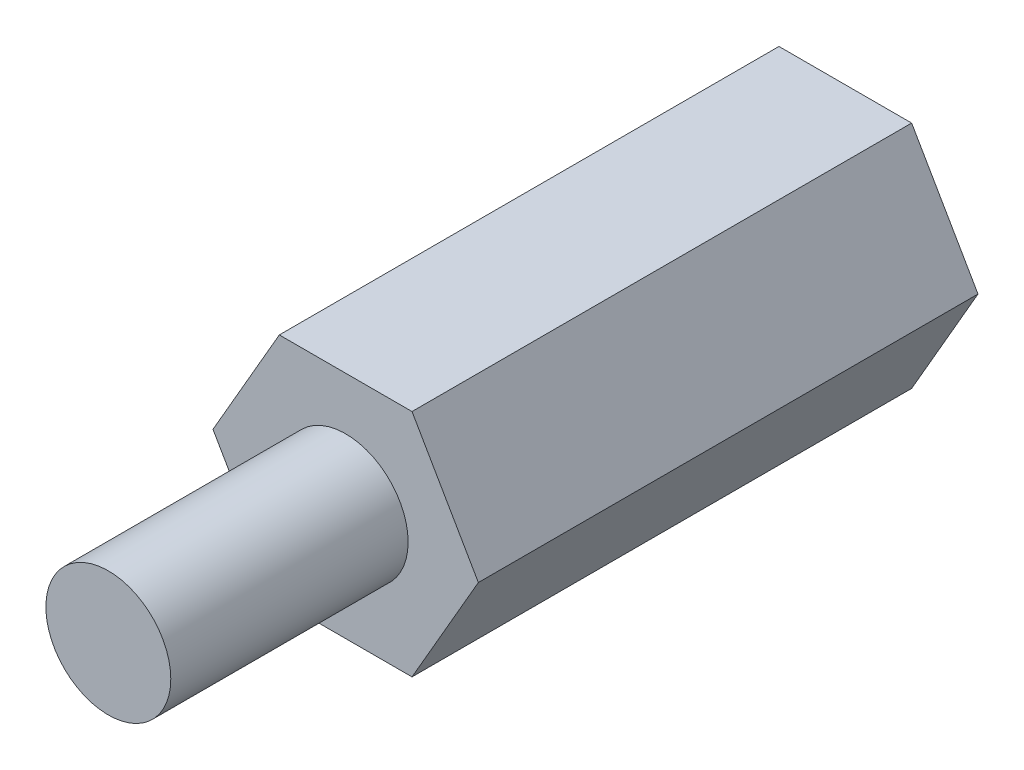
ISO-10303-21;
HEADER;
FILE_DESCRIPTION(('STEP AP214'),'2;1');
FILE_NAME('part.step','',(''),(''),'','','');
FILE_SCHEMA(('AUTOMOTIVE_DESIGN { 1 0 10303 214 1 1 1 1 }'));
ENDSEC;
DATA;
#1=APPLICATION_CONTEXT('core data for automotive mechanical design processes');
#2=APPLICATION_PROTOCOL_DEFINITION('international standard','automotive_design',2000,#1);
#3=PRODUCT_CONTEXT('',#1,'mechanical');
#4=PRODUCT('Part','Part','',(#3));
#5=PRODUCT_RELATED_PRODUCT_CATEGORY('part','',(#4));
#6=PRODUCT_DEFINITION_FORMATION('','',#4);
#7=PRODUCT_DEFINITION_CONTEXT('part definition',#1,'design');
#8=PRODUCT_DEFINITION('design','',#6,#7);
#9=PRODUCT_DEFINITION_SHAPE('','',#8);
#10=(LENGTH_UNIT() NAMED_UNIT(*) SI_UNIT(.MILLI.,.METRE.));
#11=(NAMED_UNIT(*) PLANE_ANGLE_UNIT() SI_UNIT($,.RADIAN.));
#12=(NAMED_UNIT(*) SI_UNIT($,.STERADIAN.) SOLID_ANGLE_UNIT());
#13=UNCERTAINTY_MEASURE_WITH_UNIT(LENGTH_MEASURE(1.E-05),#10,'distance_accuracy_value','');
#14=(GEOMETRIC_REPRESENTATION_CONTEXT(3) GLOBAL_UNCERTAINTY_ASSIGNED_CONTEXT((#13)) GLOBAL_UNIT_ASSIGNED_CONTEXT((#10,
#11,#12)) REPRESENTATION_CONTEXT('',''));
#15=CARTESIAN_POINT('',(0.,0.,0.));
#16=DIRECTION('',(0.,0.,1.));
#17=DIRECTION('',(1.,0.,0.));
#18=AXIS2_PLACEMENT_3D('',#15,#16,#17);
#19=CARTESIAN_POINT('',(1.32790561913614,-2.3,10.));
#20=DIRECTION('',(-0.866025403784439,0.5,0.));
#21=DIRECTION('',(-0.5,-0.866025403784439,0.));
#22=AXIS2_PLACEMENT_3D('',#19,#20,#21);
#23=PLANE('',#22);
#24=DIRECTION('',(0.5,0.866025403784439,0.));
#25=VECTOR('',#24,1.);
#26=CARTESIAN_POINT('',(1.32790561913614,-2.3,0.));
#27=LINE('',#26,#25);
#28=CARTESIAN_POINT('',(1.32790561913614,-2.3,0.));
#29=VERTEX_POINT('',#28);
#30=CARTESIAN_POINT('',(2.65581123827228,0.,0.));
#31=VERTEX_POINT('',#30);
#32=EDGE_CURVE('E121',#29,#31,#27,.T.);
#33=ORIENTED_EDGE('',*,*,#32,.T.);
#34=DIRECTION('',(0.,0.,-1.));
#35=VECTOR('',#34,1.);
#36=CARTESIAN_POINT('',(2.65581123827228,0.,10.));
#37=LINE('',#36,#35);
#38=CARTESIAN_POINT('',(2.65581123827228,0.,10.));
#39=VERTEX_POINT('',#38);
#40=EDGE_CURVE('E38',#39,#31,#37,.T.);
#41=ORIENTED_EDGE('',*,*,#40,.F.);
#42=DIRECTION('',(0.5,0.866025403784439,0.));
#43=VECTOR('',#42,1.);
#44=CARTESIAN_POINT('',(1.32790561913614,-2.3,10.));
#45=LINE('',#44,#43);
#46=CARTESIAN_POINT('',(1.32790561913614,-2.3,10.));
#47=VERTEX_POINT('',#46);
#48=EDGE_CURVE('E132',#47,#39,#45,.T.);
#49=ORIENTED_EDGE('',*,*,#48,.F.);
#50=DIRECTION('',(0.,0.,-1.));
#51=VECTOR('',#50,1.);
#52=CARTESIAN_POINT('',(1.32790561913614,-2.3,10.));
#53=LINE('',#52,#51);
#54=EDGE_CURVE('E117',#47,#29,#53,.T.);
#55=ORIENTED_EDGE('',*,*,#54,.T.);
#56=EDGE_LOOP('',(#33,#41,#49,#55));
#57=FACE_BOUND('',#56,.T.);
#58=ADVANCED_FACE('F35',(#57),#23,.F.);
#59=CARTESIAN_POINT('',(2.65581123827228,0.,10.));
#60=DIRECTION('',(-0.866025403784438,-0.5,0.));
#61=DIRECTION('',(0.5,-0.866025403784439,0.));
#62=AXIS2_PLACEMENT_3D('',#59,#60,#61);
#63=PLANE('',#62);
#64=DIRECTION('',(-0.5,0.866025403784438,0.));
#65=VECTOR('',#64,1.);
#66=CARTESIAN_POINT('',(2.65581123827228,0.,0.));
#67=LINE('',#66,#65);
#68=CARTESIAN_POINT('',(1.32790561913614,2.3,0.));
#69=VERTEX_POINT('',#68);
#70=EDGE_CURVE('E124',#31,#69,#67,.T.);
#71=ORIENTED_EDGE('',*,*,#70,.T.);
#72=DIRECTION('',(0.,0.,-1.));
#73=VECTOR('',#72,1.);
#74=CARTESIAN_POINT('',(1.32790561913614,2.3,10.));
#75=LINE('',#74,#73);
#76=CARTESIAN_POINT('',(1.32790561913614,2.3,10.));
#77=VERTEX_POINT('',#76);
#78=EDGE_CURVE('E135',#77,#69,#75,.T.);
#79=ORIENTED_EDGE('',*,*,#78,.F.);
#80=DIRECTION('',(-0.5,0.866025403784438,0.));
#81=VECTOR('',#80,1.);
#82=CARTESIAN_POINT('',(2.65581123827228,0.,10.));
#83=LINE('',#82,#81);
#84=EDGE_CURVE('E90',#39,#77,#83,.T.);
#85=ORIENTED_EDGE('',*,*,#84,.F.);
#86=ORIENTED_EDGE('',*,*,#40,.T.);
#87=EDGE_LOOP('',(#71,#79,#85,#86));
#88=FACE_BOUND('',#87,.T.);
#89=ADVANCED_FACE('F140',(#88),#63,.F.);
#90=CARTESIAN_POINT('',(1.32790561913614,2.3,10.));
#91=DIRECTION('',(0.,-1.,0.));
#92=DIRECTION('',(0.,0.,-1.));
#93=AXIS2_PLACEMENT_3D('',#90,#91,#92);
#94=PLANE('',#93);
#95=DIRECTION('',(-1.,0.,0.));
#96=VECTOR('',#95,1.);
#97=CARTESIAN_POINT('',(1.32790561913614,2.3,0.));
#98=LINE('',#97,#96);
#99=CARTESIAN_POINT('',(-1.32790561913614,2.3,0.));
#100=VERTEX_POINT('',#99);
#101=EDGE_CURVE('E127',#69,#100,#98,.T.);
#102=ORIENTED_EDGE('',*,*,#101,.T.);
#103=DIRECTION('',(0.,0.,-1.));
#104=VECTOR('',#103,1.);
#105=CARTESIAN_POINT('',(-1.32790561913614,2.3,10.));
#106=LINE('',#105,#104);
#107=CARTESIAN_POINT('',(-1.32790561913614,2.3,10.));
#108=VERTEX_POINT('',#107);
#109=EDGE_CURVE('E112',#108,#100,#106,.T.);
#110=ORIENTED_EDGE('',*,*,#109,.F.);
#111=DIRECTION('',(-1.,0.,0.));
#112=VECTOR('',#111,1.);
#113=CARTESIAN_POINT('',(1.32790561913614,2.3,10.));
#114=LINE('',#113,#112);
#115=EDGE_CURVE('E103',#77,#108,#114,.T.);
#116=ORIENTED_EDGE('',*,*,#115,.F.);
#117=ORIENTED_EDGE('',*,*,#78,.T.);
#118=EDGE_LOOP('',(#102,#110,#116,#117));
#119=FACE_BOUND('',#118,.T.);
#120=ADVANCED_FACE('F146',(#119),#94,.F.);
#121=CARTESIAN_POINT('',(-1.32790561913614,2.3,10.));
#122=DIRECTION('',(0.866025403784439,-0.5,0.));
#123=DIRECTION('',(0.5,0.866025403784439,0.));
#124=AXIS2_PLACEMENT_3D('',#121,#122,#123);
#125=PLANE('',#124);
#126=DIRECTION('',(-0.5,-0.866025403784438,0.));
#127=VECTOR('',#126,1.);
#128=CARTESIAN_POINT('',(-1.32790561913614,2.3,0.));
#129=LINE('',#128,#127);
#130=CARTESIAN_POINT('',(-2.65581123827228,0.,0.));
#131=VERTEX_POINT('',#130);
#132=EDGE_CURVE('E111',#100,#131,#129,.T.);
#133=ORIENTED_EDGE('',*,*,#132,.T.);
#134=DIRECTION('',(0.,0.,-1.));
#135=VECTOR('',#134,1.);
#136=CARTESIAN_POINT('',(-2.65581123827228,0.,10.));
#137=LINE('',#136,#135);
#138=CARTESIAN_POINT('',(-2.65581123827228,0.,10.));
#139=VERTEX_POINT('',#138);
#140=EDGE_CURVE('E108',#139,#131,#137,.T.);
#141=ORIENTED_EDGE('',*,*,#140,.F.);
#142=DIRECTION('',(-0.5,-0.866025403784438,0.));
#143=VECTOR('',#142,1.);
#144=CARTESIAN_POINT('',(-1.32790561913614,2.3,10.));
#145=LINE('',#144,#143);
#146=EDGE_CURVE('E97',#108,#139,#145,.T.);
#147=ORIENTED_EDGE('',*,*,#146,.F.);
#148=ORIENTED_EDGE('',*,*,#109,.T.);
#149=EDGE_LOOP('',(#133,#141,#147,#148));
#150=FACE_BOUND('',#149,.T.);
#151=ADVANCED_FACE('F109',(#150),#125,.F.);
#152=CARTESIAN_POINT('',(-2.65581123827228,0.,10.));
#153=DIRECTION('',(0.866025403784439,0.5,0.));
#154=DIRECTION('',(-0.5,0.866025403784439,0.));
#155=AXIS2_PLACEMENT_3D('',#152,#153,#154);
#156=PLANE('',#155);
#157=DIRECTION('',(0.5,-0.866025403784438,0.));
#158=VECTOR('',#157,1.);
#159=CARTESIAN_POINT('',(-2.65581123827228,0.,0.));
#160=LINE('',#159,#158);
#161=CARTESIAN_POINT('',(-1.32790561913614,-2.3,0.));
#162=VERTEX_POINT('',#161);
#163=EDGE_CURVE('E75',#131,#162,#160,.T.);
#164=ORIENTED_EDGE('',*,*,#163,.T.);
#165=DIRECTION('',(0.,0.,-1.));
#166=VECTOR('',#165,1.);
#167=CARTESIAN_POINT('',(-1.32790561913614,-2.3,10.));
#168=LINE('',#167,#166);
#169=CARTESIAN_POINT('',(-1.32790561913614,-2.3,10.));
#170=VERTEX_POINT('',#169);
#171=EDGE_CURVE('E113',#170,#162,#168,.T.);
#172=ORIENTED_EDGE('',*,*,#171,.F.);
#173=DIRECTION('',(0.5,-0.866025403784438,0.));
#174=VECTOR('',#173,1.);
#175=CARTESIAN_POINT('',(-2.65581123827228,0.,10.));
#176=LINE('',#175,#174);
#177=EDGE_CURVE('E101',#139,#170,#176,.T.);
#178=ORIENTED_EDGE('',*,*,#177,.F.);
#179=ORIENTED_EDGE('',*,*,#140,.T.);
#180=EDGE_LOOP('',(#164,#172,#178,#179));
#181=FACE_BOUND('',#180,.T.);
#182=ADVANCED_FACE('F115',(#181),#156,.F.);
#183=CARTESIAN_POINT('',(-1.32790561913614,-2.3,10.));
#184=DIRECTION('',(0.,1.,0.));
#185=DIRECTION('',(0.,0.,1.));
#186=AXIS2_PLACEMENT_3D('',#183,#184,#185);
#187=PLANE('',#186);
#188=DIRECTION('',(1.,0.,0.));
#189=VECTOR('',#188,1.);
#190=CARTESIAN_POINT('',(-1.32790561913614,-2.3,0.));
#191=LINE('',#190,#189);
#192=EDGE_CURVE('E81',#162,#29,#191,.T.);
#193=ORIENTED_EDGE('',*,*,#192,.T.);
#194=ORIENTED_EDGE('',*,*,#54,.F.);
#195=DIRECTION('',(1.,0.,0.));
#196=VECTOR('',#195,1.);
#197=CARTESIAN_POINT('',(-1.32790561913614,-2.3,10.));
#198=LINE('',#197,#196);
#199=EDGE_CURVE('E52',#170,#47,#198,.T.);
#200=ORIENTED_EDGE('',*,*,#199,.F.);
#201=ORIENTED_EDGE('',*,*,#171,.T.);
#202=EDGE_LOOP('',(#193,#194,#200,#201));
#203=FACE_BOUND('',#202,.T.);
#204=ADVANCED_FACE('F177',(#203),#187,.F.);
#205=CARTESIAN_POINT('',(0.,0.,10.));
#206=DIRECTION('',(0.,0.,1.));
#207=DIRECTION('',(1.,0.,0.));
#208=AXIS2_PLACEMENT_3D('',#205,#206,#207);
#209=PLANE('',#208);
#210=CARTESIAN_POINT('',(0.,0.,10.));
#211=DIRECTION('',(0.,0.,1.));
#212=DIRECTION('',(1.,0.,0.));
#213=AXIS2_PLACEMENT_3D('',#210,#211,#212);
#214=CIRCLE('',#213,1.25);
#215=CARTESIAN_POINT('',(1.25,0.,10.));
#216=VERTEX_POINT('',#215);
#217=EDGE_CURVE('E11',#216,#216,#214,.T.);
#218=ORIENTED_EDGE('',*,*,#217,.F.);
#219=EDGE_LOOP('',(#218));
#220=FACE_BOUND('',#219,.T.);
#221=ORIENTED_EDGE('',*,*,#48,.T.);
#222=ORIENTED_EDGE('',*,*,#84,.T.);
#223=ORIENTED_EDGE('',*,*,#115,.T.);
#224=ORIENTED_EDGE('',*,*,#146,.T.);
#225=ORIENTED_EDGE('',*,*,#177,.T.);
#226=ORIENTED_EDGE('',*,*,#199,.T.);
#227=EDGE_LOOP('',(#221,#222,#223,#224,#225,#226));
#228=FACE_BOUND('',#227,.T.);
#229=ADVANCED_FACE('F99',(#220,#228),#209,.T.);
#230=CARTESIAN_POINT('',(0.,0.,0.));
#231=DIRECTION('',(0.,0.,1.));
#232=DIRECTION('',(1.,0.,0.));
#233=AXIS2_PLACEMENT_3D('',#230,#231,#232);
#234=PLANE('',#233);
#235=CARTESIAN_POINT('',(0.,0.,0.));
#236=DIRECTION('',(0.,0.,-1.));
#237=DIRECTION('',(-1.,0.,0.));
#238=AXIS2_PLACEMENT_3D('',#235,#236,#237);
#239=CIRCLE('',#238,1.25);
#240=CARTESIAN_POINT('',(-1.25,0.,0.));
#241=VERTEX_POINT('',#240);
#242=EDGE_CURVE('E153',#241,#241,#239,.T.);
#243=ORIENTED_EDGE('',*,*,#242,.F.);
#244=EDGE_LOOP('',(#243));
#245=FACE_BOUND('',#244,.T.);
#246=ORIENTED_EDGE('',*,*,#32,.F.);
#247=ORIENTED_EDGE('',*,*,#192,.F.);
#248=ORIENTED_EDGE('',*,*,#163,.F.);
#249=ORIENTED_EDGE('',*,*,#132,.F.);
#250=ORIENTED_EDGE('',*,*,#101,.F.);
#251=ORIENTED_EDGE('',*,*,#70,.F.);
#252=EDGE_LOOP('',(#246,#247,#248,#249,#250,#251));
#253=FACE_BOUND('',#252,.T.);
#254=ADVANCED_FACE('F145',(#245,#253),#234,.F.);
#255=CARTESIAN_POINT('',(0.,0.,14.75));
#256=DIRECTION('',(0.,0.,-1.));
#257=DIRECTION('',(-1.,0.,0.));
#258=AXIS2_PLACEMENT_3D('',#255,#256,#257);
#259=CYLINDRICAL_SURFACE('',#258,1.25);
#260=CARTESIAN_POINT('',(0.,0.,14.75));
#261=DIRECTION('',(0.,0.,1.));
#262=DIRECTION('',(1.,0.,0.));
#263=AXIS2_PLACEMENT_3D('',#260,#261,#262);
#264=CIRCLE('',#263,1.25);
#265=CARTESIAN_POINT('',(1.25,0.,14.75));
#266=VERTEX_POINT('',#265);
#267=EDGE_CURVE('E125',#266,#266,#264,.T.);
#268=ORIENTED_EDGE('',*,*,#267,.F.);
#269=EDGE_LOOP('',(#268));
#270=FACE_BOUND('',#269,.T.);
#271=ORIENTED_EDGE('',*,*,#217,.T.);
#272=EDGE_LOOP('',(#271));
#273=FACE_BOUND('',#272,.T.);
#274=ADVANCED_FACE('F169',(#270,#273),#259,.T.);
#275=CARTESIAN_POINT('',(0.,0.,14.75));
#276=DIRECTION('',(0.,0.,1.));
#277=DIRECTION('',(1.,0.,0.));
#278=AXIS2_PLACEMENT_3D('',#275,#276,#277);
#279=PLANE('',#278);
#280=ORIENTED_EDGE('',*,*,#267,.T.);
#281=EDGE_LOOP('',(#280));
#282=FACE_BOUND('',#281,.T.);
#283=ADVANCED_FACE('F164',(#282),#279,.T.);
#284=CARTESIAN_POINT('',(0.,0.,6.4));
#285=DIRECTION('',(0.,0.,-1.));
#286=DIRECTION('',(-1.,0.,0.));
#287=AXIS2_PLACEMENT_3D('',#284,#285,#286);
#288=CYLINDRICAL_SURFACE('',#287,1.25);
#289=CARTESIAN_POINT('',(0.,0.,6.4));
#290=DIRECTION('',(0.,0.,-1.));
#291=DIRECTION('',(-1.,0.,0.));
#292=AXIS2_PLACEMENT_3D('',#289,#290,#291);
#293=CIRCLE('',#292,1.25);
#294=CARTESIAN_POINT('',(-1.25,0.,6.4));
#295=VERTEX_POINT('',#294);
#296=EDGE_CURVE('E152',#295,#295,#293,.T.);
#297=ORIENTED_EDGE('',*,*,#296,.F.);
#298=EDGE_LOOP('',(#297));
#299=FACE_BOUND('',#298,.T.);
#300=ORIENTED_EDGE('',*,*,#242,.T.);
#301=EDGE_LOOP('',(#300));
#302=FACE_BOUND('',#301,.T.);
#303=ADVANCED_FACE('F161',(#299,#302),#288,.F.);
#304=CARTESIAN_POINT('',(0.,0.,6.4));
#305=DIRECTION('',(0.,0.,-1.));
#306=DIRECTION('',(-1.,0.,0.));
#307=AXIS2_PLACEMENT_3D('',#304,#305,#306);
#308=PLANE('',#307);
#309=ORIENTED_EDGE('',*,*,#296,.T.);
#310=EDGE_LOOP('',(#309));
#311=FACE_BOUND('',#310,.T.);
#312=ADVANCED_FACE('F159',(#311),#308,.T.);
#313=CLOSED_SHELL('',(#58,#89,#120,#151,#182,#204,#229,#254,#274,#283,#303,#312));
#314=MANIFOLD_SOLID_BREP('B2',#313);
#315=ADVANCED_BREP_SHAPE_REPRESENTATION('',(#18,#314),#14);
#316=SHAPE_DEFINITION_REPRESENTATION(#9,#315);
ENDSEC;
END-ISO-10303-21;
